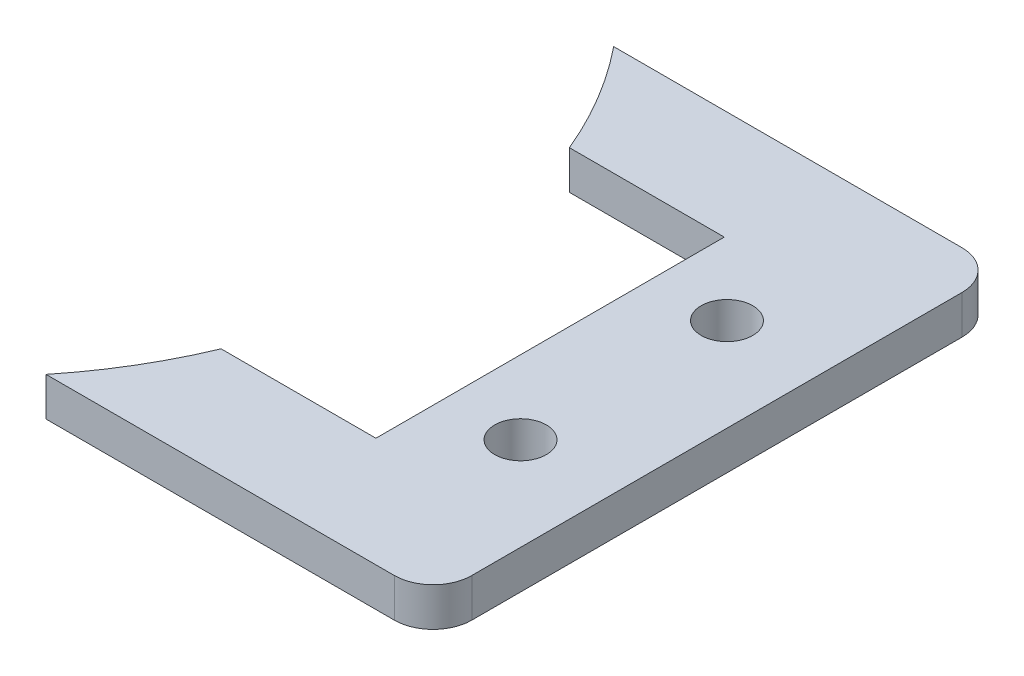
ISO-10303-21;
HEADER;
FILE_DESCRIPTION(('STEP AP214'),'2;1');
FILE_NAME('part.step','',(''),(''),'','','');
FILE_SCHEMA(('AUTOMOTIVE_DESIGN { 1 0 10303 214 1 1 1 1 }'));
ENDSEC;
DATA;
#1=APPLICATION_CONTEXT('core data for automotive mechanical design processes');
#2=APPLICATION_PROTOCOL_DEFINITION('international standard','automotive_design',2000,#1);
#3=PRODUCT_CONTEXT('',#1,'mechanical');
#4=PRODUCT('Part','Part','',(#3));
#5=PRODUCT_RELATED_PRODUCT_CATEGORY('part','',(#4));
#6=PRODUCT_DEFINITION_FORMATION('','',#4);
#7=PRODUCT_DEFINITION_CONTEXT('part definition',#1,'design');
#8=PRODUCT_DEFINITION('design','',#6,#7);
#9=PRODUCT_DEFINITION_SHAPE('','',#8);
#10=(LENGTH_UNIT() NAMED_UNIT(*) SI_UNIT(.MILLI.,.METRE.));
#11=(NAMED_UNIT(*) PLANE_ANGLE_UNIT() SI_UNIT($,.RADIAN.));
#12=(NAMED_UNIT(*) SI_UNIT($,.STERADIAN.) SOLID_ANGLE_UNIT());
#13=UNCERTAINTY_MEASURE_WITH_UNIT(LENGTH_MEASURE(1.E-05),#10,'distance_accuracy_value','');
#14=(GEOMETRIC_REPRESENTATION_CONTEXT(3) GLOBAL_UNCERTAINTY_ASSIGNED_CONTEXT((#13)) GLOBAL_UNIT_ASSIGNED_CONTEXT((#10,
#11,#12)) REPRESENTATION_CONTEXT('',''));
#15=CARTESIAN_POINT('',(0.,0.,0.));
#16=DIRECTION('',(0.,0.,1.));
#17=DIRECTION('',(1.,0.,0.));
#18=AXIS2_PLACEMENT_3D('',#15,#16,#17);
#19=CARTESIAN_POINT('',(0.,3.,0.));
#20=DIRECTION('',(0.,-1.,0.));
#21=DIRECTION('',(0.,0.,-1.));
#22=AXIS2_PLACEMENT_3D('',#19,#20,#21);
#23=CYLINDRICAL_SURFACE('',#22,35.);
#24=CARTESIAN_POINT('',(0.,0.,0.));
#25=DIRECTION('',(0.,1.,0.));
#26=DIRECTION('',(0.,0.,1.));
#27=AXIS2_PLACEMENT_3D('',#24,#25,#26);
#28=CIRCLE('',#27,35.);
#29=CARTESIAN_POINT('',(27.2213151776324,0.,22.));
#30=VERTEX_POINT('',#29);
#31=CARTESIAN_POINT('',(32.2916397849351,0.,13.5));
#32=VERTEX_POINT('',#31);
#33=EDGE_CURVE('E129',#30,#32,#28,.T.);
#34=ORIENTED_EDGE('',*,*,#33,.F.);
#35=DIRECTION('',(0.,-1.,0.));
#36=VECTOR('',#35,1.);
#37=CARTESIAN_POINT('',(27.2213151776324,3.,22.));
#38=LINE('',#37,#36);
#39=CARTESIAN_POINT('',(27.2213151776324,3.,22.));
#40=VERTEX_POINT('',#39);
#41=EDGE_CURVE('E124',#40,#30,#38,.T.);
#42=ORIENTED_EDGE('',*,*,#41,.F.);
#43=CARTESIAN_POINT('',(0.,3.,0.));
#44=DIRECTION('',(0.,1.,0.));
#45=DIRECTION('',(0.,0.,1.));
#46=AXIS2_PLACEMENT_3D('',#43,#44,#45);
#47=CIRCLE('',#46,35.);
#48=CARTESIAN_POINT('',(32.2916397849351,3.,13.5));
#49=VERTEX_POINT('',#48);
#50=EDGE_CURVE('E126',#40,#49,#47,.T.);
#51=ORIENTED_EDGE('',*,*,#50,.T.);
#52=DIRECTION('',(0.,-1.,0.));
#53=VECTOR('',#52,1.);
#54=CARTESIAN_POINT('',(32.2916397849351,3.,13.5));
#55=LINE('',#54,#53);
#56=EDGE_CURVE('E183',#49,#32,#55,.T.);
#57=ORIENTED_EDGE('',*,*,#56,.T.);
#58=EDGE_LOOP('',(#34,#42,#51,#57));
#59=FACE_BOUND('',#58,.T.);
#60=ADVANCED_FACE('F45',(#59),#23,.F.);
#61=CARTESIAN_POINT('',(0.,3.,22.));
#62=DIRECTION('',(0.,0.,-1.));
#63=DIRECTION('',(-1.,0.,0.));
#64=AXIS2_PLACEMENT_3D('',#61,#62,#63);
#65=PLANE('',#64);
#66=DIRECTION('',(1.,0.,0.));
#67=VECTOR('',#66,1.);
#68=CARTESIAN_POINT('',(0.,0.,22.));
#69=LINE('',#68,#67);
#70=CARTESIAN_POINT('',(54.2213151776324,0.,22.));
#71=VERTEX_POINT('',#70);
#72=EDGE_CURVE('E186',#30,#71,#69,.T.);
#73=ORIENTED_EDGE('',*,*,#72,.T.);
#74=DIRECTION('',(0.,-1.,0.));
#75=VECTOR('',#74,1.);
#76=CARTESIAN_POINT('',(54.2213151776324,3.,22.));
#77=LINE('',#76,#75);
#78=CARTESIAN_POINT('',(54.2213151776324,3.,22.));
#79=VERTEX_POINT('',#78);
#80=EDGE_CURVE('E11',#71,#79,#77,.F.);
#81=ORIENTED_EDGE('',*,*,#80,.T.);
#82=DIRECTION('',(1.,0.,0.));
#83=VECTOR('',#82,1.);
#84=CARTESIAN_POINT('',(0.,3.,22.));
#85=LINE('',#84,#83);
#86=EDGE_CURVE('E135',#40,#79,#85,.T.);
#87=ORIENTED_EDGE('',*,*,#86,.F.);
#88=ORIENTED_EDGE('',*,*,#41,.T.);
#89=EDGE_LOOP('',(#73,#81,#87,#88));
#90=FACE_BOUND('',#89,.T.);
#91=ADVANCED_FACE('F136',(#90),#65,.F.);
#92=CARTESIAN_POINT('',(57.2213151776324,3.,0.));
#93=DIRECTION('',(1.,0.,0.));
#94=DIRECTION('',(0.,0.,-1.));
#95=AXIS2_PLACEMENT_3D('',#92,#93,#94);
#96=PLANE('',#95);
#97=DIRECTION('',(0.,0.,1.));
#98=VECTOR('',#97,1.);
#99=CARTESIAN_POINT('',(57.2213151776324,0.,0.));
#100=LINE('',#99,#98);
#101=CARTESIAN_POINT('',(57.2213151776324,0.,-19.));
#102=VERTEX_POINT('',#101);
#103=CARTESIAN_POINT('',(57.2213151776324,0.,19.));
#104=VERTEX_POINT('',#103);
#105=EDGE_CURVE('E190',#102,#104,#100,.T.);
#106=ORIENTED_EDGE('',*,*,#105,.F.);
#107=DIRECTION('',(0.,-1.,0.));
#108=VECTOR('',#107,1.);
#109=CARTESIAN_POINT('',(57.2213151776324,3.,-19.));
#110=LINE('',#109,#108);
#111=CARTESIAN_POINT('',(57.2213151776324,3.,-19.));
#112=VERTEX_POINT('',#111);
#113=EDGE_CURVE('E238',#102,#112,#110,.F.);
#114=ORIENTED_EDGE('',*,*,#113,.T.);
#115=DIRECTION('',(0.,0.,1.));
#116=VECTOR('',#115,1.);
#117=CARTESIAN_POINT('',(57.2213151776324,3.,0.));
#118=LINE('',#117,#116);
#119=CARTESIAN_POINT('',(57.2213151776324,3.,19.));
#120=VERTEX_POINT('',#119);
#121=EDGE_CURVE('E138',#112,#120,#118,.T.);
#122=ORIENTED_EDGE('',*,*,#121,.T.);
#123=DIRECTION('',(0.,-1.,0.));
#124=VECTOR('',#123,1.);
#125=CARTESIAN_POINT('',(57.2213151776324,0.,19.));
#126=LINE('',#125,#124);
#127=EDGE_CURVE('E234',#120,#104,#126,.T.);
#128=ORIENTED_EDGE('',*,*,#127,.T.);
#129=EDGE_LOOP('',(#106,#114,#122,#128));
#130=FACE_BOUND('',#129,.T.);
#131=ADVANCED_FACE('F273',(#130),#96,.T.);
#132=CARTESIAN_POINT('',(0.,3.,-22.));
#133=DIRECTION('',(0.,0.,-1.));
#134=DIRECTION('',(-1.,0.,0.));
#135=AXIS2_PLACEMENT_3D('',#132,#133,#134);
#136=PLANE('',#135);
#137=DIRECTION('',(1.,0.,0.));
#138=VECTOR('',#137,1.);
#139=CARTESIAN_POINT('',(0.,3.,-22.));
#140=LINE('',#139,#138);
#141=CARTESIAN_POINT('',(27.2213151776324,3.,-22.));
#142=VERTEX_POINT('',#141);
#143=CARTESIAN_POINT('',(54.2213151776324,3.,-22.));
#144=VERTEX_POINT('',#143);
#145=EDGE_CURVE('E155',#142,#144,#140,.T.);
#146=ORIENTED_EDGE('',*,*,#145,.T.);
#147=DIRECTION('',(0.,-1.,0.));
#148=VECTOR('',#147,1.);
#149=CARTESIAN_POINT('',(54.2213151776324,3.,-22.));
#150=LINE('',#149,#148);
#151=CARTESIAN_POINT('',(54.2213151776324,0.,-22.));
#152=VERTEX_POINT('',#151);
#153=EDGE_CURVE('E132',#144,#152,#150,.T.);
#154=ORIENTED_EDGE('',*,*,#153,.T.);
#155=DIRECTION('',(1.,0.,0.));
#156=VECTOR('',#155,1.);
#157=CARTESIAN_POINT('',(0.,0.,-22.));
#158=LINE('',#157,#156);
#159=CARTESIAN_POINT('',(27.2213151776324,0.,-22.));
#160=VERTEX_POINT('',#159);
#161=EDGE_CURVE('E194',#160,#152,#158,.T.);
#162=ORIENTED_EDGE('',*,*,#161,.F.);
#163=DIRECTION('',(0.,-1.,0.));
#164=VECTOR('',#163,1.);
#165=CARTESIAN_POINT('',(27.2213151776324,3.,-22.));
#166=LINE('',#165,#164);
#167=EDGE_CURVE('E133',#142,#160,#166,.T.);
#168=ORIENTED_EDGE('',*,*,#167,.F.);
#169=EDGE_LOOP('',(#146,#154,#162,#168));
#170=FACE_BOUND('',#169,.T.);
#171=ADVANCED_FACE('F248',(#170),#136,.T.);
#172=CARTESIAN_POINT('',(32.2916397849351,0.,-13.5));
#173=VERTEX_POINT('',#172);
#174=EDGE_CURVE('E187',#173,#160,#28,.T.);
#175=ORIENTED_EDGE('',*,*,#174,.F.);
#176=DIRECTION('',(0.,-1.,0.));
#177=VECTOR('',#176,1.);
#178=CARTESIAN_POINT('',(32.2916397849351,3.,-13.5));
#179=LINE('',#178,#177);
#180=CARTESIAN_POINT('',(32.2916397849351,3.,-13.5));
#181=VERTEX_POINT('',#180);
#182=EDGE_CURVE('E221',#181,#173,#179,.T.);
#183=ORIENTED_EDGE('',*,*,#182,.F.);
#184=EDGE_CURVE('E147',#181,#142,#47,.T.);
#185=ORIENTED_EDGE('',*,*,#184,.T.);
#186=ORIENTED_EDGE('',*,*,#167,.T.);
#187=EDGE_LOOP('',(#175,#183,#185,#186));
#188=FACE_BOUND('',#187,.T.);
#189=ADVANCED_FACE('F258',(#188),#23,.F.);
#190=CARTESIAN_POINT('',(0.,3.,-13.5));
#191=DIRECTION('',(0.,0.,-1.));
#192=DIRECTION('',(-1.,0.,0.));
#193=AXIS2_PLACEMENT_3D('',#190,#191,#192);
#194=PLANE('',#193);
#195=DIRECTION('',(1.,0.,0.));
#196=VECTOR('',#195,1.);
#197=CARTESIAN_POINT('',(0.,0.,-13.5));
#198=LINE('',#197,#196);
#199=CARTESIAN_POINT('',(44.2916397849351,0.,-13.5));
#200=VERTEX_POINT('',#199);
#201=EDGE_CURVE('E198',#173,#200,#198,.T.);
#202=ORIENTED_EDGE('',*,*,#201,.T.);
#203=DIRECTION('',(0.,-1.,0.));
#204=VECTOR('',#203,1.);
#205=CARTESIAN_POINT('',(44.2916397849351,3.,-13.5));
#206=LINE('',#205,#204);
#207=CARTESIAN_POINT('',(44.2916397849351,3.,-13.5));
#208=VERTEX_POINT('',#207);
#209=EDGE_CURVE('E217',#208,#200,#206,.T.);
#210=ORIENTED_EDGE('',*,*,#209,.F.);
#211=DIRECTION('',(1.,0.,0.));
#212=VECTOR('',#211,1.);
#213=CARTESIAN_POINT('',(0.,3.,-13.5));
#214=LINE('',#213,#212);
#215=EDGE_CURVE('E154',#181,#208,#214,.T.);
#216=ORIENTED_EDGE('',*,*,#215,.F.);
#217=ORIENTED_EDGE('',*,*,#182,.T.);
#218=EDGE_LOOP('',(#202,#210,#216,#217));
#219=FACE_BOUND('',#218,.T.);
#220=ADVANCED_FACE('F262',(#219),#194,.F.);
#221=CARTESIAN_POINT('',(44.2916397849351,3.,0.));
#222=DIRECTION('',(1.,0.,0.));
#223=DIRECTION('',(0.,0.,-1.));
#224=AXIS2_PLACEMENT_3D('',#221,#222,#223);
#225=PLANE('',#224);
#226=DIRECTION('',(0.,0.,1.));
#227=VECTOR('',#226,1.);
#228=CARTESIAN_POINT('',(44.2916397849351,0.,0.));
#229=LINE('',#228,#227);
#230=CARTESIAN_POINT('',(44.2916397849351,0.,13.5));
#231=VERTEX_POINT('',#230);
#232=EDGE_CURVE('E201',#200,#231,#229,.T.);
#233=ORIENTED_EDGE('',*,*,#232,.T.);
#234=DIRECTION('',(0.,-1.,0.));
#235=VECTOR('',#234,1.);
#236=CARTESIAN_POINT('',(44.2916397849351,3.,13.5));
#237=LINE('',#236,#235);
#238=CARTESIAN_POINT('',(44.2916397849351,3.,13.5));
#239=VERTEX_POINT('',#238);
#240=EDGE_CURVE('E214',#239,#231,#237,.T.);
#241=ORIENTED_EDGE('',*,*,#240,.F.);
#242=DIRECTION('',(0.,0.,1.));
#243=VECTOR('',#242,1.);
#244=CARTESIAN_POINT('',(44.2916397849351,3.,0.));
#245=LINE('',#244,#243);
#246=EDGE_CURVE('E160',#208,#239,#245,.T.);
#247=ORIENTED_EDGE('',*,*,#246,.F.);
#248=ORIENTED_EDGE('',*,*,#209,.T.);
#249=EDGE_LOOP('',(#233,#241,#247,#248));
#250=FACE_BOUND('',#249,.T.);
#251=ADVANCED_FACE('F266',(#250),#225,.F.);
#252=CARTESIAN_POINT('',(50.,3.,-8.));
#253=DIRECTION('',(0.,-1.,0.));
#254=DIRECTION('',(0.,0.,-1.));
#255=AXIS2_PLACEMENT_3D('',#252,#253,#254);
#256=CYLINDRICAL_SURFACE('',#255,2.);
#257=CARTESIAN_POINT('',(50.,3.,-8.));
#258=DIRECTION('',(0.,1.,0.));
#259=DIRECTION('',(0.,0.,1.));
#260=AXIS2_PLACEMENT_3D('',#257,#258,#259);
#261=CIRCLE('',#260,2.);
#262=CARTESIAN_POINT('',(50.,3.,-6.));
#263=VERTEX_POINT('',#262);
#264=EDGE_CURVE('E175',#263,#263,#261,.T.);
#265=ORIENTED_EDGE('',*,*,#264,.T.);
#266=EDGE_LOOP('',(#265));
#267=FACE_BOUND('',#266,.T.);
#268=CARTESIAN_POINT('',(50.,0.,-8.));
#269=DIRECTION('',(0.,1.,0.));
#270=DIRECTION('',(0.,0.,1.));
#271=AXIS2_PLACEMENT_3D('',#268,#269,#270);
#272=CIRCLE('',#271,2.);
#273=CARTESIAN_POINT('',(50.,0.,-6.));
#274=VERTEX_POINT('',#273);
#275=EDGE_CURVE('E150',#274,#274,#272,.T.);
#276=ORIENTED_EDGE('',*,*,#275,.F.);
#277=EDGE_LOOP('',(#276));
#278=FACE_BOUND('',#277,.T.);
#279=ADVANCED_FACE('F294',(#267,#278),#256,.F.);
#280=CARTESIAN_POINT('',(0.,3.,13.5));
#281=DIRECTION('',(0.,0.,-1.));
#282=DIRECTION('',(-1.,0.,0.));
#283=AXIS2_PLACEMENT_3D('',#280,#281,#282);
#284=PLANE('',#283);
#285=DIRECTION('',(1.,0.,0.));
#286=VECTOR('',#285,1.);
#287=CARTESIAN_POINT('',(0.,0.,13.5));
#288=LINE('',#287,#286);
#289=EDGE_CURVE('E205',#32,#231,#288,.T.);
#290=ORIENTED_EDGE('',*,*,#289,.F.);
#291=ORIENTED_EDGE('',*,*,#56,.F.);
#292=DIRECTION('',(1.,0.,0.));
#293=VECTOR('',#292,1.);
#294=CARTESIAN_POINT('',(0.,3.,13.5));
#295=LINE('',#294,#293);
#296=EDGE_CURVE('E143',#49,#239,#295,.T.);
#297=ORIENTED_EDGE('',*,*,#296,.T.);
#298=ORIENTED_EDGE('',*,*,#240,.T.);
#299=EDGE_LOOP('',(#290,#291,#297,#298));
#300=FACE_BOUND('',#299,.T.);
#301=ADVANCED_FACE('F269',(#300),#284,.T.);
#302=CARTESIAN_POINT('',(50.,3.,8.));
#303=DIRECTION('',(0.,-1.,0.));
#304=DIRECTION('',(0.,0.,-1.));
#305=AXIS2_PLACEMENT_3D('',#302,#303,#304);
#306=CYLINDRICAL_SURFACE('',#305,2.);
#307=CARTESIAN_POINT('',(50.,3.,8.));
#308=DIRECTION('',(0.,1.,0.));
#309=DIRECTION('',(0.,0.,1.));
#310=AXIS2_PLACEMENT_3D('',#307,#308,#309);
#311=CIRCLE('',#310,2.);
#312=CARTESIAN_POINT('',(50.,3.,10.));
#313=VERTEX_POINT('',#312);
#314=EDGE_CURVE('E179',#313,#313,#311,.F.);
#315=ORIENTED_EDGE('',*,*,#314,.F.);
#316=EDGE_LOOP('',(#315));
#317=FACE_BOUND('',#316,.T.);
#318=CARTESIAN_POINT('',(50.,0.,8.));
#319=DIRECTION('',(0.,1.,0.));
#320=DIRECTION('',(0.,0.,1.));
#321=AXIS2_PLACEMENT_3D('',#318,#319,#320);
#322=CIRCLE('',#321,2.);
#323=CARTESIAN_POINT('',(50.,0.,10.));
#324=VERTEX_POINT('',#323);
#325=EDGE_CURVE('E145',#324,#324,#322,.F.);
#326=ORIENTED_EDGE('',*,*,#325,.T.);
#327=EDGE_LOOP('',(#326));
#328=FACE_BOUND('',#327,.T.);
#329=ADVANCED_FACE('F299',(#317,#328),#306,.F.);
#330=CARTESIAN_POINT('',(0.,3.,0.));
#331=DIRECTION('',(0.,1.,0.));
#332=DIRECTION('',(0.,0.,1.));
#333=AXIS2_PLACEMENT_3D('',#330,#331,#332);
#334=PLANE('',#333);
#335=ORIENTED_EDGE('',*,*,#121,.F.);
#336=CARTESIAN_POINT('',(54.2213151776324,3.,-19.));
#337=DIRECTION('',(0.,1.,0.));
#338=DIRECTION('',(0.,0.,1.));
#339=AXIS2_PLACEMENT_3D('',#336,#337,#338);
#340=CIRCLE('',#339,3.);
#341=EDGE_CURVE('E54',#112,#144,#340,.T.);
#342=ORIENTED_EDGE('',*,*,#341,.T.);
#343=ORIENTED_EDGE('',*,*,#145,.F.);
#344=ORIENTED_EDGE('',*,*,#184,.F.);
#345=ORIENTED_EDGE('',*,*,#215,.T.);
#346=ORIENTED_EDGE('',*,*,#246,.T.);
#347=ORIENTED_EDGE('',*,*,#296,.F.);
#348=ORIENTED_EDGE('',*,*,#50,.F.);
#349=ORIENTED_EDGE('',*,*,#86,.T.);
#350=CARTESIAN_POINT('',(54.2213151776324,3.,19.));
#351=DIRECTION('',(0.,1.,0.));
#352=DIRECTION('',(0.,0.,1.));
#353=AXIS2_PLACEMENT_3D('',#350,#351,#352);
#354=CIRCLE('',#353,3.);
#355=EDGE_CURVE('E66',#79,#120,#354,.T.);
#356=ORIENTED_EDGE('',*,*,#355,.T.);
#357=EDGE_LOOP('',(#335,#342,#343,#344,#345,#346,#347,#348,#349,#356));
#358=FACE_BOUND('',#357,.T.);
#359=ORIENTED_EDGE('',*,*,#264,.F.);
#360=EDGE_LOOP('',(#359));
#361=FACE_BOUND('',#360,.T.);
#362=ORIENTED_EDGE('',*,*,#314,.T.);
#363=EDGE_LOOP('',(#362));
#364=FACE_BOUND('',#363,.T.);
#365=ADVANCED_FACE('F140',(#358,#361,#364),#334,.T.);
#366=CARTESIAN_POINT('',(0.,0.,0.));
#367=DIRECTION('',(0.,1.,0.));
#368=DIRECTION('',(0.,0.,1.));
#369=AXIS2_PLACEMENT_3D('',#366,#367,#368);
#370=PLANE('',#369);
#371=ORIENTED_EDGE('',*,*,#161,.T.);
#372=CARTESIAN_POINT('',(54.2213151776324,0.,-19.));
#373=DIRECTION('',(0.,1.,0.));
#374=DIRECTION('',(0.,0.,1.));
#375=AXIS2_PLACEMENT_3D('',#372,#373,#374);
#376=CIRCLE('',#375,3.);
#377=EDGE_CURVE('E231',#152,#102,#376,.F.);
#378=ORIENTED_EDGE('',*,*,#377,.T.);
#379=ORIENTED_EDGE('',*,*,#105,.T.);
#380=CARTESIAN_POINT('',(54.2213151776324,0.,19.));
#381=DIRECTION('',(0.,1.,0.));
#382=DIRECTION('',(0.,0.,1.));
#383=AXIS2_PLACEMENT_3D('',#380,#381,#382);
#384=CIRCLE('',#383,3.);
#385=EDGE_CURVE('E228',#104,#71,#384,.F.);
#386=ORIENTED_EDGE('',*,*,#385,.T.);
#387=ORIENTED_EDGE('',*,*,#72,.F.);
#388=ORIENTED_EDGE('',*,*,#33,.T.);
#389=ORIENTED_EDGE('',*,*,#289,.T.);
#390=ORIENTED_EDGE('',*,*,#232,.F.);
#391=ORIENTED_EDGE('',*,*,#201,.F.);
#392=ORIENTED_EDGE('',*,*,#174,.T.);
#393=EDGE_LOOP('',(#371,#378,#379,#386,#387,#388,#389,#390,#391,#392));
#394=FACE_BOUND('',#393,.T.);
#395=ORIENTED_EDGE('',*,*,#275,.T.);
#396=EDGE_LOOP('',(#395));
#397=FACE_BOUND('',#396,.T.);
#398=ORIENTED_EDGE('',*,*,#325,.F.);
#399=EDGE_LOOP('',(#398));
#400=FACE_BOUND('',#399,.T.);
#401=ADVANCED_FACE('F251',(#394,#397,#400),#370,.F.);
#402=CARTESIAN_POINT('',(54.2213151776324,3.,-19.));
#403=DIRECTION('',(0.,-1.,0.));
#404=DIRECTION('',(0.,0.,-1.));
#405=AXIS2_PLACEMENT_3D('',#402,#403,#404);
#406=CYLINDRICAL_SURFACE('',#405,3.);
#407=ORIENTED_EDGE('',*,*,#341,.F.);
#408=ORIENTED_EDGE('',*,*,#113,.F.);
#409=ORIENTED_EDGE('',*,*,#377,.F.);
#410=ORIENTED_EDGE('',*,*,#153,.F.);
#411=EDGE_LOOP('',(#407,#408,#409,#410));
#412=FACE_BOUND('',#411,.T.);
#413=ADVANCED_FACE('F246',(#412),#406,.T.);
#414=CARTESIAN_POINT('',(54.2213151776324,3.,19.));
#415=DIRECTION('',(0.,1.,0.));
#416=DIRECTION('',(0.,0.,1.));
#417=AXIS2_PLACEMENT_3D('',#414,#415,#416);
#418=CYLINDRICAL_SURFACE('',#417,3.);
#419=ORIENTED_EDGE('',*,*,#355,.F.);
#420=ORIENTED_EDGE('',*,*,#80,.F.);
#421=ORIENTED_EDGE('',*,*,#385,.F.);
#422=ORIENTED_EDGE('',*,*,#127,.F.);
#423=EDGE_LOOP('',(#419,#420,#421,#422));
#424=FACE_BOUND('',#423,.T.);
#425=ADVANCED_FACE('F47',(#424),#418,.T.);
#426=CLOSED_SHELL('',(#60,#91,#131,#171,#189,#220,#251,#279,#301,#329,#365,#401,#413,#425));
#427=MANIFOLD_SOLID_BREP('B2',#426);
#428=ADVANCED_BREP_SHAPE_REPRESENTATION('',(#18,#427),#14);
#429=SHAPE_DEFINITION_REPRESENTATION(#9,#428);
ENDSEC;
END-ISO-10303-21;
